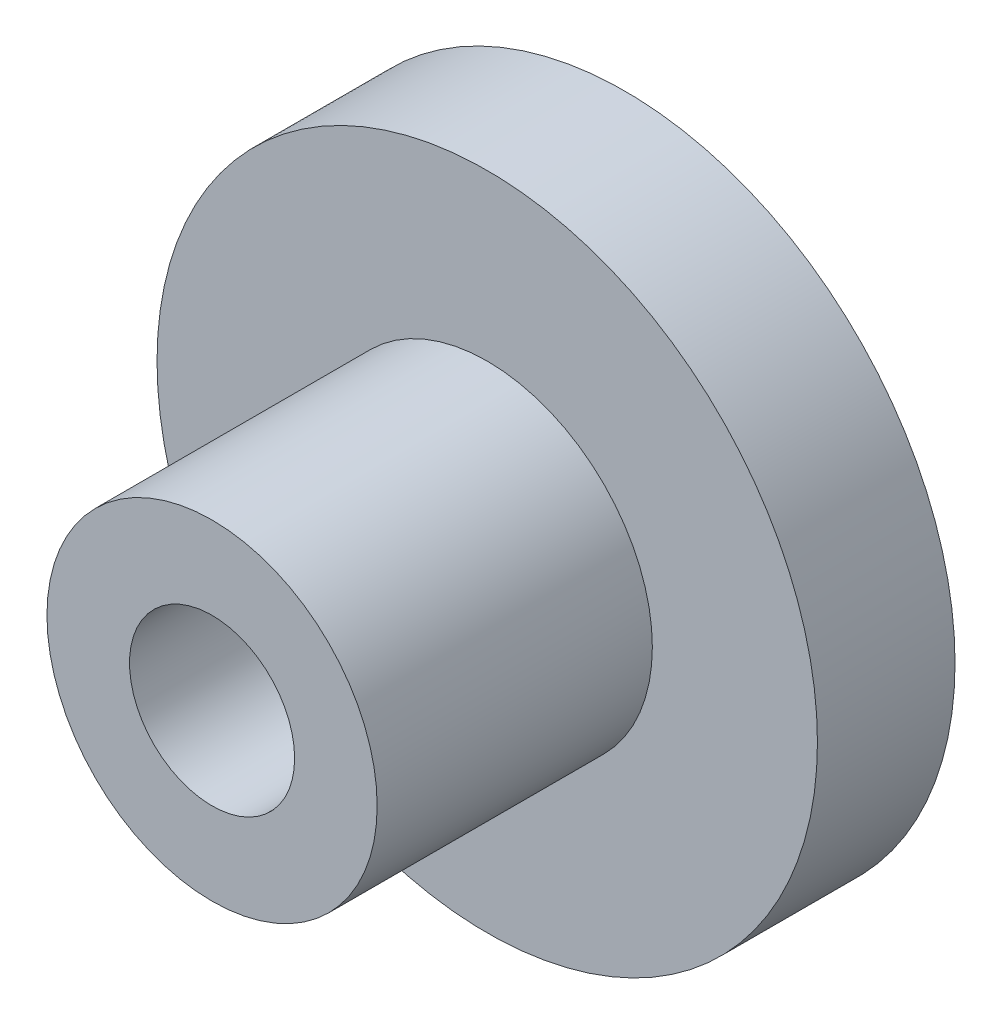
ISO-10303-21;
HEADER;
FILE_DESCRIPTION(('STEP AP214'),'2;1');
FILE_NAME('part.step','',(''),(''),'','','');
FILE_SCHEMA(('AUTOMOTIVE_DESIGN { 1 0 10303 214 1 1 1 1 }'));
ENDSEC;
DATA;
#1=APPLICATION_CONTEXT('core data for automotive mechanical design processes');
#2=APPLICATION_PROTOCOL_DEFINITION('international standard','automotive_design',2000,#1);
#3=PRODUCT_CONTEXT('',#1,'mechanical');
#4=PRODUCT('Part','Part','',(#3));
#5=PRODUCT_RELATED_PRODUCT_CATEGORY('part','',(#4));
#6=PRODUCT_DEFINITION_FORMATION('','',#4);
#7=PRODUCT_DEFINITION_CONTEXT('part definition',#1,'design');
#8=PRODUCT_DEFINITION('design','',#6,#7);
#9=PRODUCT_DEFINITION_SHAPE('','',#8);
#10=(LENGTH_UNIT() NAMED_UNIT(*) SI_UNIT(.MILLI.,.METRE.));
#11=(NAMED_UNIT(*) PLANE_ANGLE_UNIT() SI_UNIT($,.RADIAN.));
#12=(NAMED_UNIT(*) SI_UNIT($,.STERADIAN.) SOLID_ANGLE_UNIT());
#13=UNCERTAINTY_MEASURE_WITH_UNIT(LENGTH_MEASURE(1.E-05),#10,'distance_accuracy_value','');
#14=(GEOMETRIC_REPRESENTATION_CONTEXT(3) GLOBAL_UNCERTAINTY_ASSIGNED_CONTEXT((#13)) GLOBAL_UNIT_ASSIGNED_CONTEXT((#10,
#11,#12)) REPRESENTATION_CONTEXT('',''));
#15=CARTESIAN_POINT('',(0.,0.,0.));
#16=DIRECTION('',(0.,0.,1.));
#17=DIRECTION('',(1.,0.,0.));
#18=AXIS2_PLACEMENT_3D('',#15,#16,#17);
#19=CARTESIAN_POINT('',(0.,0.,2.5));
#20=DIRECTION('',(0.,0.,1.));
#21=DIRECTION('',(1.,0.,0.));
#22=AXIS2_PLACEMENT_3D('',#19,#20,#21);
#23=PLANE('',#22);
#24=CARTESIAN_POINT('',(0.,0.,2.5));
#25=DIRECTION('',(0.,0.,1.));
#26=DIRECTION('',(1.,0.,0.));
#27=AXIS2_PLACEMENT_3D('',#24,#25,#26);
#28=CIRCLE('',#27,6.);
#29=CARTESIAN_POINT('',(6.,0.,2.5));
#30=VERTEX_POINT('',#29);
#31=EDGE_CURVE('E10',#30,#30,#28,.T.);
#32=ORIENTED_EDGE('',*,*,#31,.T.);
#33=EDGE_LOOP('',(#32));
#34=FACE_BOUND('',#33,.T.);
#35=CARTESIAN_POINT('',(0.,0.,2.5));
#36=DIRECTION('',(0.,0.,1.));
#37=DIRECTION('',(1.,0.,0.));
#38=AXIS2_PLACEMENT_3D('',#35,#36,#37);
#39=CIRCLE('',#38,3.);
#40=CARTESIAN_POINT('',(3.,0.,2.5));
#41=VERTEX_POINT('',#40);
#42=EDGE_CURVE('E43',#41,#41,#39,.T.);
#43=ORIENTED_EDGE('',*,*,#42,.F.);
#44=EDGE_LOOP('',(#43));
#45=FACE_BOUND('',#44,.T.);
#46=ADVANCED_FACE('F30',(#34,#45),#23,.T.);
#47=CARTESIAN_POINT('',(0.,0.,2.5));
#48=DIRECTION('',(0.,0.,-1.));
#49=DIRECTION('',(-1.,0.,0.));
#50=AXIS2_PLACEMENT_3D('',#47,#48,#49);
#51=CYLINDRICAL_SURFACE('',#50,6.);
#52=ORIENTED_EDGE('',*,*,#31,.F.);
#53=EDGE_LOOP('',(#52));
#54=FACE_BOUND('',#53,.T.);
#55=CARTESIAN_POINT('',(0.,0.,0.));
#56=DIRECTION('',(0.,0.,1.));
#57=DIRECTION('',(1.,0.,0.));
#58=AXIS2_PLACEMENT_3D('',#55,#56,#57);
#59=CIRCLE('',#58,6.);
#60=CARTESIAN_POINT('',(6.,0.,0.));
#61=VERTEX_POINT('',#60);
#62=EDGE_CURVE('E34',#61,#61,#59,.T.);
#63=ORIENTED_EDGE('',*,*,#62,.T.);
#64=EDGE_LOOP('',(#63));
#65=FACE_BOUND('',#64,.T.);
#66=ADVANCED_FACE('F32',(#54,#65),#51,.T.);
#67=CARTESIAN_POINT('',(0.,0.,0.));
#68=DIRECTION('',(0.,0.,1.));
#69=DIRECTION('',(1.,0.,0.));
#70=AXIS2_PLACEMENT_3D('',#67,#68,#69);
#71=PLANE('',#70);
#72=CARTESIAN_POINT('',(0.,0.,0.));
#73=DIRECTION('',(0.,0.,1.));
#74=DIRECTION('',(1.,0.,0.));
#75=AXIS2_PLACEMENT_3D('',#72,#73,#74);
#76=CIRCLE('',#75,1.5);
#77=CARTESIAN_POINT('',(1.5,0.,0.));
#78=VERTEX_POINT('',#77);
#79=EDGE_CURVE('E46',#78,#78,#76,.T.);
#80=ORIENTED_EDGE('',*,*,#79,.T.);
#81=EDGE_LOOP('',(#80));
#82=FACE_BOUND('',#81,.T.);
#83=ORIENTED_EDGE('',*,*,#62,.F.);
#84=EDGE_LOOP('',(#83));
#85=FACE_BOUND('',#84,.T.);
#86=ADVANCED_FACE('F55',(#82,#85),#71,.F.);
#87=CARTESIAN_POINT('',(0.,0.,7.5));
#88=DIRECTION('',(0.,0.,-1.));
#89=DIRECTION('',(-1.,0.,0.));
#90=AXIS2_PLACEMENT_3D('',#87,#88,#89);
#91=CYLINDRICAL_SURFACE('',#90,3.);
#92=CARTESIAN_POINT('',(0.,0.,7.5));
#93=DIRECTION('',(0.,0.,1.));
#94=DIRECTION('',(1.,0.,0.));
#95=AXIS2_PLACEMENT_3D('',#92,#93,#94);
#96=CIRCLE('',#95,3.);
#97=CARTESIAN_POINT('',(3.,0.,7.5));
#98=VERTEX_POINT('',#97);
#99=EDGE_CURVE('E41',#98,#98,#96,.T.);
#100=ORIENTED_EDGE('',*,*,#99,.F.);
#101=EDGE_LOOP('',(#100));
#102=FACE_BOUND('',#101,.T.);
#103=ORIENTED_EDGE('',*,*,#42,.T.);
#104=EDGE_LOOP('',(#103));
#105=FACE_BOUND('',#104,.T.);
#106=ADVANCED_FACE('F67',(#102,#105),#91,.T.);
#107=CARTESIAN_POINT('',(0.,0.,7.5));
#108=DIRECTION('',(0.,0.,1.));
#109=DIRECTION('',(1.,0.,0.));
#110=AXIS2_PLACEMENT_3D('',#107,#108,#109);
#111=PLANE('',#110);
#112=CARTESIAN_POINT('',(0.,0.,7.5));
#113=DIRECTION('',(0.,0.,1.));
#114=DIRECTION('',(1.,0.,0.));
#115=AXIS2_PLACEMENT_3D('',#112,#113,#114);
#116=CIRCLE('',#115,1.5);
#117=CARTESIAN_POINT('',(1.5,0.,7.5));
#118=VERTEX_POINT('',#117);
#119=EDGE_CURVE('E49',#118,#118,#116,.T.);
#120=ORIENTED_EDGE('',*,*,#119,.F.);
#121=EDGE_LOOP('',(#120));
#122=FACE_BOUND('',#121,.T.);
#123=ORIENTED_EDGE('',*,*,#99,.T.);
#124=EDGE_LOOP('',(#123));
#125=FACE_BOUND('',#124,.T.);
#126=ADVANCED_FACE('F61',(#122,#125),#111,.T.);
#127=CARTESIAN_POINT('',(0.,0.,0.));
#128=DIRECTION('',(0.,0.,1.));
#129=DIRECTION('',(1.,0.,0.));
#130=AXIS2_PLACEMENT_3D('',#127,#128,#129);
#131=CYLINDRICAL_SURFACE('',#130,1.5);
#132=ORIENTED_EDGE('',*,*,#79,.F.);
#133=EDGE_LOOP('',(#132));
#134=FACE_BOUND('',#133,.T.);
#135=ORIENTED_EDGE('',*,*,#119,.T.);
#136=EDGE_LOOP('',(#135));
#137=FACE_BOUND('',#136,.T.);
#138=ADVANCED_FACE('F58',(#134,#137),#131,.F.);
#139=CLOSED_SHELL('',(#46,#66,#86,#106,#126,#138));
#140=MANIFOLD_SOLID_BREP('B2',#139);
#141=ADVANCED_BREP_SHAPE_REPRESENTATION('',(#18,#140),#14);
#142=SHAPE_DEFINITION_REPRESENTATION(#9,#141);
ENDSEC;
END-ISO-10303-21;
